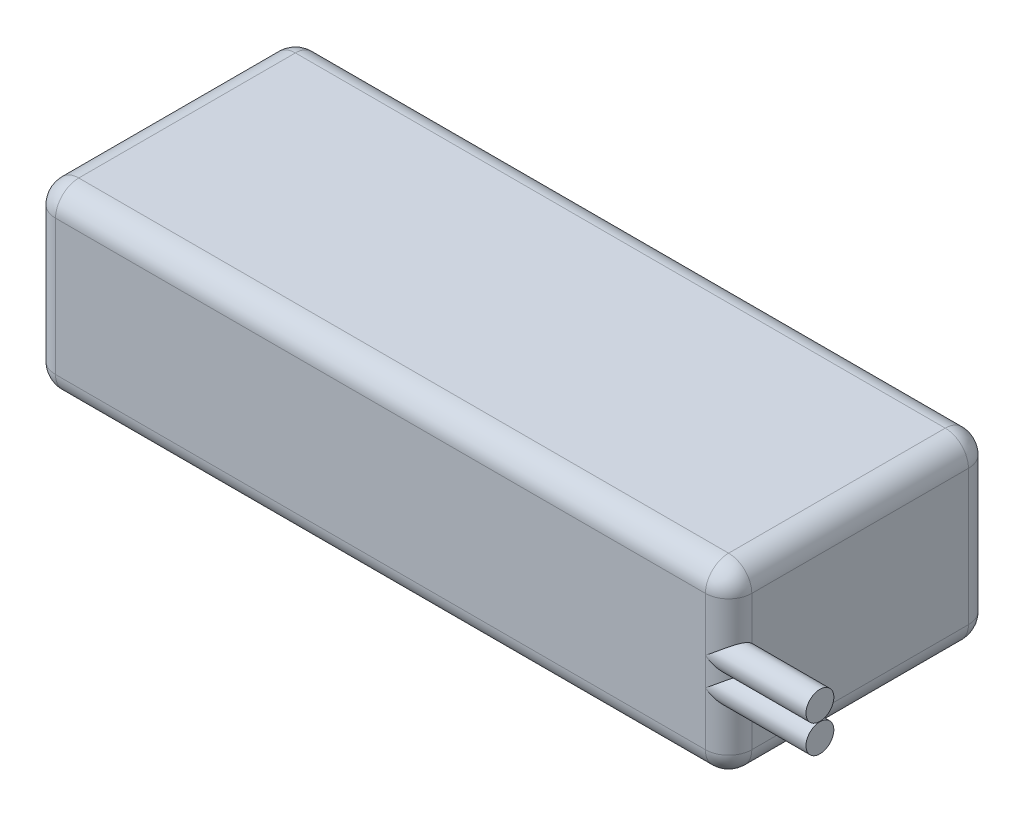
ISO-10303-21;
HEADER;
FILE_DESCRIPTION(('STEP AP214'),'2;1');
FILE_NAME('part.step','',(''),(''),'','','');
FILE_SCHEMA(('AUTOMOTIVE_DESIGN { 1 0 10303 214 1 1 1 1 }'));
ENDSEC;
DATA;
#1=APPLICATION_CONTEXT('core data for automotive mechanical design processes');
#2=APPLICATION_PROTOCOL_DEFINITION('international standard','automotive_design',2000,#1);
#3=PRODUCT_CONTEXT('',#1,'mechanical');
#4=PRODUCT('Part','Part','',(#3));
#5=PRODUCT_RELATED_PRODUCT_CATEGORY('part','',(#4));
#6=PRODUCT_DEFINITION_FORMATION('','',#4);
#7=PRODUCT_DEFINITION_CONTEXT('part definition',#1,'design');
#8=PRODUCT_DEFINITION('design','',#6,#7);
#9=PRODUCT_DEFINITION_SHAPE('','',#8);
#10=(LENGTH_UNIT() NAMED_UNIT(*) SI_UNIT(.MILLI.,.METRE.));
#11=(NAMED_UNIT(*) PLANE_ANGLE_UNIT() SI_UNIT($,.RADIAN.));
#12=(NAMED_UNIT(*) SI_UNIT($,.STERADIAN.) SOLID_ANGLE_UNIT());
#13=UNCERTAINTY_MEASURE_WITH_UNIT(LENGTH_MEASURE(1.E-05),#10,'distance_accuracy_value','');
#14=(GEOMETRIC_REPRESENTATION_CONTEXT(3) GLOBAL_UNCERTAINTY_ASSIGNED_CONTEXT((#13)) GLOBAL_UNIT_ASSIGNED_CONTEXT((#10,
#11,#12)) REPRESENTATION_CONTEXT('',''));
#15=CARTESIAN_POINT('',(0.,0.,0.));
#16=DIRECTION('',(0.,0.,1.));
#17=DIRECTION('',(1.,0.,0.));
#18=AXIS2_PLACEMENT_3D('',#15,#16,#17);
#19=CARTESIAN_POINT('',(-42.6513569937369,23.5,-15.3131524008351));
#20=DIRECTION('',(1.,0.,0.));
#21=DIRECTION('',(0.,0.,-1.));
#22=AXIS2_PLACEMENT_3D('',#19,#20,#21);
#23=PLANE('',#22);
#24=DIRECTION('',(0.,-1.,0.));
#25=VECTOR('',#24,1.);
#26=CARTESIAN_POINT('',(-42.6513569937369,23.5,15.6868475991649));
#27=LINE('',#26,#25);
#28=CARTESIAN_POINT('',(-42.6513569937369,3.,15.6868475991649));
#29=VERTEX_POINT('',#28);
#30=CARTESIAN_POINT('',(-42.6513569937369,20.5,15.6868475991649));
#31=VERTEX_POINT('',#30);
#32=EDGE_CURVE('E158',#29,#31,#27,.F.);
#33=ORIENTED_EDGE('',*,*,#32,.T.);
#34=DIRECTION('',(0.,0.,1.));
#35=VECTOR('',#34,1.);
#36=CARTESIAN_POINT('',(-42.6513569937369,20.5,-15.3131524008351));
#37=LINE('',#36,#35);
#38=CARTESIAN_POINT('',(-42.6513569937369,20.5,-12.3131524008351));
#39=VERTEX_POINT('',#38);
#40=EDGE_CURVE('E204',#31,#39,#37,.F.);
#41=ORIENTED_EDGE('',*,*,#40,.T.);
#42=DIRECTION('',(0.,-1.,0.));
#43=VECTOR('',#42,1.);
#44=CARTESIAN_POINT('',(-42.6513569937369,23.5,-12.3131524008351));
#45=LINE('',#44,#43);
#46=CARTESIAN_POINT('',(-42.6513569937369,3.,-12.3131524008351));
#47=VERTEX_POINT('',#46);
#48=EDGE_CURVE('E200',#39,#47,#45,.T.);
#49=ORIENTED_EDGE('',*,*,#48,.T.);
#50=DIRECTION('',(0.,0.,1.));
#51=VECTOR('',#50,1.);
#52=CARTESIAN_POINT('',(-42.6513569937369,3.,-15.3131524008351));
#53=LINE('',#52,#51);
#54=EDGE_CURVE('E193',#47,#29,#53,.T.);
#55=ORIENTED_EDGE('',*,*,#54,.T.);
#56=EDGE_LOOP('',(#33,#41,#49,#55));
#57=FACE_BOUND('',#56,.T.);
#58=ADVANCED_FACE('F40',(#57),#23,.F.);
#59=CARTESIAN_POINT('',(-42.6513569937369,23.5,18.6868475991649));
#60=DIRECTION('',(0.,0.,-1.));
#61=DIRECTION('',(-1.,0.,0.));
#62=AXIS2_PLACEMENT_3D('',#59,#60,#61);
#63=PLANE('',#62);
#64=DIRECTION('',(0.,-1.,0.));
#65=VECTOR('',#64,1.);
#66=CARTESIAN_POINT('',(44.3486430062631,23.5,18.6868475991649));
#67=LINE('',#66,#65);
#68=CARTESIAN_POINT('',(44.3486430062631,13.57,18.6868475991649));
#69=VERTEX_POINT('',#68);
#70=CARTESIAN_POINT('',(44.3486430062631,20.5,18.6868475991649));
#71=VERTEX_POINT('',#70);
#72=EDGE_CURVE('E189',#69,#71,#67,.F.);
#73=ORIENTED_EDGE('',*,*,#72,.T.);
#74=DIRECTION('',(1.,0.,0.));
#75=VECTOR('',#74,1.);
#76=CARTESIAN_POINT('',(-42.6513569937369,20.5,18.6868475991649));
#77=LINE('',#76,#75);
#78=CARTESIAN_POINT('',(-39.6513569937369,20.5,18.6868475991649));
#79=VERTEX_POINT('',#78);
#80=EDGE_CURVE('E186',#71,#79,#77,.F.);
#81=ORIENTED_EDGE('',*,*,#80,.T.);
#82=DIRECTION('',(0.,-1.,0.));
#83=VECTOR('',#82,1.);
#84=CARTESIAN_POINT('',(-39.6513569937369,23.5,18.6868475991649));
#85=LINE('',#84,#83);
#86=CARTESIAN_POINT('',(-39.6513569937369,3.,18.6868475991649));
#87=VERTEX_POINT('',#86);
#88=EDGE_CURVE('E156',#79,#87,#85,.T.);
#89=ORIENTED_EDGE('',*,*,#88,.T.);
#90=DIRECTION('',(1.,0.,0.));
#91=VECTOR('',#90,1.);
#92=CARTESIAN_POINT('',(-42.6513569937369,3.,18.6868475991649));
#93=LINE('',#92,#91);
#94=CARTESIAN_POINT('',(44.3486430062631,3.,18.6868475991649));
#95=VERTEX_POINT('',#94);
#96=EDGE_CURVE('E174',#87,#95,#93,.T.);
#97=ORIENTED_EDGE('',*,*,#96,.T.);
#98=DIRECTION('',(0.,-1.,0.));
#99=VECTOR('',#98,1.);
#100=CARTESIAN_POINT('',(44.3486430062631,23.5,18.6868475991649));
#101=LINE('',#100,#99);
#102=CARTESIAN_POINT('',(44.3486430062631,9.93,18.6868475991649));
#103=VERTEX_POINT('',#102);
#104=EDGE_CURVE('E181',#95,#103,#101,.F.);
#105=ORIENTED_EDGE('',*,*,#104,.T.);
#106=DIRECTION('',(0.,-1.,0.));
#107=VECTOR('',#106,1.);
#108=CARTESIAN_POINT('',(44.3486430062631,23.5,18.6868475991649));
#109=LINE('',#108,#107);
#110=EDGE_CURVE('E195',#103,#69,#109,.F.);
#111=ORIENTED_EDGE('',*,*,#110,.T.);
#112=EDGE_LOOP('',(#73,#81,#89,#97,#105,#111));
#113=FACE_BOUND('',#112,.T.);
#114=ADVANCED_FACE('F184',(#113),#63,.F.);
#115=CARTESIAN_POINT('',(47.3486430062631,23.5,-15.3131524008351));
#116=DIRECTION('',(-1.,0.,0.));
#117=DIRECTION('',(0.,0.,1.));
#118=AXIS2_PLACEMENT_3D('',#115,#116,#117);
#119=PLANE('',#118);
#120=CARTESIAN_POINT('',(47.3486430062631,13.57,16.8868475991649));
#121=DIRECTION('',(1.,0.,0.));
#122=DIRECTION('',(0.,0.,-1.));
#123=AXIS2_PLACEMENT_3D('',#120,#121,#122);
#124=CIRCLE('',#123,1.8);
#125=CARTESIAN_POINT('',(47.3486430062631,12.2283592135001,15.6868475991649));
#126=VERTEX_POINT('',#125);
#127=CARTESIAN_POINT('',(47.3486430062631,14.9116407864999,15.6868475991649));
#128=VERTEX_POINT('',#127);
#129=EDGE_CURVE('E411',#126,#128,#124,.T.);
#130=ORIENTED_EDGE('',*,*,#129,.F.);
#131=DIRECTION('',(0.,-1.,0.));
#132=VECTOR('',#131,1.);
#133=CARTESIAN_POINT('',(47.3486430062631,23.5,15.6868475991649));
#134=LINE('',#133,#132);
#135=CARTESIAN_POINT('',(47.3486430062631,11.2716407864999,15.6868475991649));
#136=VERTEX_POINT('',#135);
#137=EDGE_CURVE('E218',#126,#136,#134,.T.);
#138=ORIENTED_EDGE('',*,*,#137,.T.);
#139=CARTESIAN_POINT('',(47.3486430062631,9.93,16.8868475991649));
#140=DIRECTION('',(1.,0.,0.));
#141=DIRECTION('',(0.,0.,-1.));
#142=AXIS2_PLACEMENT_3D('',#139,#140,#141);
#143=CIRCLE('',#142,1.8);
#144=CARTESIAN_POINT('',(47.3486430062631,8.58835921350013,15.6868475991649));
#145=VERTEX_POINT('',#144);
#146=EDGE_CURVE('E401',#145,#136,#143,.T.);
#147=ORIENTED_EDGE('',*,*,#146,.F.);
#148=DIRECTION('',(0.,-1.,0.));
#149=VECTOR('',#148,1.);
#150=CARTESIAN_POINT('',(47.3486430062631,23.5,15.6868475991649));
#151=LINE('',#150,#149);
#152=CARTESIAN_POINT('',(47.3486430062631,3.,15.6868475991649));
#153=VERTEX_POINT('',#152);
#154=EDGE_CURVE('E211',#145,#153,#151,.T.);
#155=ORIENTED_EDGE('',*,*,#154,.T.);
#156=DIRECTION('',(0.,0.,-1.));
#157=VECTOR('',#156,1.);
#158=CARTESIAN_POINT('',(47.3486430062631,3.,-15.3131524008351));
#159=LINE('',#158,#157);
#160=CARTESIAN_POINT('',(47.3486430062631,3.,-12.3131524008351));
#161=VERTEX_POINT('',#160);
#162=EDGE_CURVE('E207',#153,#161,#159,.T.);
#163=ORIENTED_EDGE('',*,*,#162,.T.);
#164=DIRECTION('',(0.,-1.,0.));
#165=VECTOR('',#164,1.);
#166=CARTESIAN_POINT('',(47.3486430062631,23.5,-12.3131524008351));
#167=LINE('',#166,#165);
#168=CARTESIAN_POINT('',(47.3486430062631,20.5,-12.3131524008351));
#169=VERTEX_POINT('',#168);
#170=EDGE_CURVE('E209',#161,#169,#167,.F.);
#171=ORIENTED_EDGE('',*,*,#170,.T.);
#172=DIRECTION('',(0.,0.,-1.));
#173=VECTOR('',#172,1.);
#174=CARTESIAN_POINT('',(47.3486430062631,20.5,18.6868475991649));
#175=LINE('',#174,#173);
#176=CARTESIAN_POINT('',(47.3486430062631,20.5,15.6868475991649));
#177=VERTEX_POINT('',#176);
#178=EDGE_CURVE('E213',#169,#177,#175,.F.);
#179=ORIENTED_EDGE('',*,*,#178,.T.);
#180=DIRECTION('',(0.,-1.,0.));
#181=VECTOR('',#180,1.);
#182=CARTESIAN_POINT('',(47.3486430062631,23.5,15.6868475991649));
#183=LINE('',#182,#181);
#184=EDGE_CURVE('E215',#177,#128,#183,.T.);
#185=ORIENTED_EDGE('',*,*,#184,.T.);
#186=EDGE_LOOP('',(#130,#138,#147,#155,#163,#171,#179,#185));
#187=FACE_BOUND('',#186,.T.);
#188=ADVANCED_FACE('F321',(#187),#119,.F.);
#189=CARTESIAN_POINT('',(-42.6513569937369,23.5,-15.3131524008351));
#190=DIRECTION('',(0.,0.,1.));
#191=DIRECTION('',(1.,0.,0.));
#192=AXIS2_PLACEMENT_3D('',#189,#190,#191);
#193=PLANE('',#192);
#194=DIRECTION('',(0.,-1.,0.));
#195=VECTOR('',#194,1.);
#196=CARTESIAN_POINT('',(-39.6513569937369,23.5,-15.3131524008351));
#197=LINE('',#196,#195);
#198=CARTESIAN_POINT('',(-39.6513569937369,3.,-15.3131524008351));
#199=VERTEX_POINT('',#198);
#200=CARTESIAN_POINT('',(-39.6513569937369,20.5,-15.3131524008351));
#201=VERTEX_POINT('',#200);
#202=EDGE_CURVE('E223',#199,#201,#197,.F.);
#203=ORIENTED_EDGE('',*,*,#202,.T.);
#204=DIRECTION('',(-1.,0.,0.));
#205=VECTOR('',#204,1.);
#206=CARTESIAN_POINT('',(47.3486430062631,20.5,-15.3131524008351));
#207=LINE('',#206,#205);
#208=CARTESIAN_POINT('',(44.3486430062631,20.5,-15.3131524008351));
#209=VERTEX_POINT('',#208);
#210=EDGE_CURVE('E228',#201,#209,#207,.F.);
#211=ORIENTED_EDGE('',*,*,#210,.T.);
#212=DIRECTION('',(0.,-1.,0.));
#213=VECTOR('',#212,1.);
#214=CARTESIAN_POINT('',(44.3486430062631,23.5,-15.3131524008351));
#215=LINE('',#214,#213);
#216=CARTESIAN_POINT('',(44.3486430062631,3.,-15.3131524008351));
#217=VERTEX_POINT('',#216);
#218=EDGE_CURVE('E225',#209,#217,#215,.T.);
#219=ORIENTED_EDGE('',*,*,#218,.T.);
#220=DIRECTION('',(-1.,0.,0.));
#221=VECTOR('',#220,1.);
#222=CARTESIAN_POINT('',(-42.6513569937369,3.,-15.3131524008351));
#223=LINE('',#222,#221);
#224=EDGE_CURVE('E220',#217,#199,#223,.T.);
#225=ORIENTED_EDGE('',*,*,#224,.T.);
#226=EDGE_LOOP('',(#203,#211,#219,#225));
#227=FACE_BOUND('',#226,.T.);
#228=ADVANCED_FACE('F483',(#227),#193,.F.);
#229=CARTESIAN_POINT('',(0.,23.5,0.));
#230=DIRECTION('',(0.,1.,0.));
#231=DIRECTION('',(0.,0.,1.));
#232=AXIS2_PLACEMENT_3D('',#229,#230,#231);
#233=PLANE('',#232);
#234=DIRECTION('',(0.,0.,-1.));
#235=VECTOR('',#234,1.);
#236=CARTESIAN_POINT('',(44.3486430062631,23.5,-15.3131524008351));
#237=LINE('',#236,#235);
#238=CARTESIAN_POINT('',(44.3486430062631,23.5,15.6868475991649));
#239=VERTEX_POINT('',#238);
#240=CARTESIAN_POINT('',(44.3486430062631,23.5,-12.3131524008351));
#241=VERTEX_POINT('',#240);
#242=EDGE_CURVE('E235',#239,#241,#237,.T.);
#243=ORIENTED_EDGE('',*,*,#242,.T.);
#244=DIRECTION('',(-1.,0.,0.));
#245=VECTOR('',#244,1.);
#246=CARTESIAN_POINT('',(-42.6513569937369,23.5,-12.3131524008351));
#247=LINE('',#246,#245);
#248=CARTESIAN_POINT('',(-39.6513569937369,23.5,-12.3131524008351));
#249=VERTEX_POINT('',#248);
#250=EDGE_CURVE('E237',#241,#249,#247,.T.);
#251=ORIENTED_EDGE('',*,*,#250,.T.);
#252=DIRECTION('',(0.,0.,1.));
#253=VECTOR('',#252,1.);
#254=CARTESIAN_POINT('',(-39.6513569937369,23.5,18.6868475991649));
#255=LINE('',#254,#253);
#256=CARTESIAN_POINT('',(-39.6513569937369,23.5,15.6868475991649));
#257=VERTEX_POINT('',#256);
#258=EDGE_CURVE('E230',#249,#257,#255,.T.);
#259=ORIENTED_EDGE('',*,*,#258,.T.);
#260=DIRECTION('',(1.,0.,0.));
#261=VECTOR('',#260,1.);
#262=CARTESIAN_POINT('',(47.3486430062631,23.5,15.6868475991649));
#263=LINE('',#262,#261);
#264=EDGE_CURVE('E232',#257,#239,#263,.T.);
#265=ORIENTED_EDGE('',*,*,#264,.T.);
#266=EDGE_LOOP('',(#243,#251,#259,#265));
#267=FACE_BOUND('',#266,.T.);
#268=ADVANCED_FACE('F477',(#267),#233,.T.);
#269=CARTESIAN_POINT('',(0.,0.,0.));
#270=DIRECTION('',(0.,1.,0.));
#271=DIRECTION('',(0.,0.,1.));
#272=AXIS2_PLACEMENT_3D('',#269,#270,#271);
#273=PLANE('',#272);
#274=DIRECTION('',(0.,0.,-1.));
#275=VECTOR('',#274,1.);
#276=CARTESIAN_POINT('',(44.3486430062631,0.,0.));
#277=LINE('',#276,#275);
#278=CARTESIAN_POINT('',(44.3486430062631,0.,-12.3131524008351));
#279=VERTEX_POINT('',#278);
#280=CARTESIAN_POINT('',(44.3486430062631,0.,15.6868475991649));
#281=VERTEX_POINT('',#280);
#282=EDGE_CURVE('E244',#279,#281,#277,.F.);
#283=ORIENTED_EDGE('',*,*,#282,.T.);
#284=DIRECTION('',(1.,0.,0.));
#285=VECTOR('',#284,1.);
#286=CARTESIAN_POINT('',(0.,0.,15.6868475991649));
#287=LINE('',#286,#285);
#288=CARTESIAN_POINT('',(-39.6513569937369,0.,15.6868475991649));
#289=VERTEX_POINT('',#288);
#290=EDGE_CURVE('E246',#281,#289,#287,.F.);
#291=ORIENTED_EDGE('',*,*,#290,.T.);
#292=DIRECTION('',(0.,0.,1.));
#293=VECTOR('',#292,1.);
#294=CARTESIAN_POINT('',(-39.6513569937369,0.,0.));
#295=LINE('',#294,#293);
#296=CARTESIAN_POINT('',(-39.6513569937369,0.,-12.3131524008351));
#297=VERTEX_POINT('',#296);
#298=EDGE_CURVE('E240',#289,#297,#295,.F.);
#299=ORIENTED_EDGE('',*,*,#298,.T.);
#300=DIRECTION('',(-1.,0.,0.));
#301=VECTOR('',#300,1.);
#302=CARTESIAN_POINT('',(0.,0.,-12.3131524008351));
#303=LINE('',#302,#301);
#304=EDGE_CURVE('E242',#297,#279,#303,.F.);
#305=ORIENTED_EDGE('',*,*,#304,.T.);
#306=EDGE_LOOP('',(#283,#291,#299,#305));
#307=FACE_BOUND('',#306,.T.);
#308=ADVANCED_FACE('F312',(#307),#273,.F.);
#309=CARTESIAN_POINT('',(57.3486430062631,13.57,16.8868475991649));
#310=DIRECTION('',(-1.,0.,0.));
#311=DIRECTION('',(0.,0.,1.));
#312=AXIS2_PLACEMENT_3D('',#309,#310,#311);
#313=CYLINDRICAL_SURFACE('',#312,1.8);
#314=CARTESIAN_POINT('',(57.3486430062631,13.57,16.8868475991649));
#315=DIRECTION('',(1.,0.,0.));
#316=DIRECTION('',(0.,0.,-1.));
#317=AXIS2_PLACEMENT_3D('',#314,#315,#316);
#318=CIRCLE('',#317,1.8);
#319=CARTESIAN_POINT('',(57.3486430062631,13.57,15.0868475991649));
#320=VERTEX_POINT('',#319);
#321=EDGE_CURVE('E182',#320,#320,#318,.T.);
#322=ORIENTED_EDGE('',*,*,#321,.F.);
#323=EDGE_LOOP('',(#322));
#324=FACE_BOUND('',#323,.T.);
#325=CARTESIAN_POINT('',(47.3486430062631,14.9116407864998,15.6868475991649));
#326=CARTESIAN_POINT('',(47.3486458378384,14.9421026291827,15.720896157732));
#327=CARTESIAN_POINT('',(47.3480633616879,14.9712623522462,15.7561155584714));
#328=CARTESIAN_POINT('',(47.3455091274964,15.0268076541683,15.8286447765796));
#329=CARTESIAN_POINT('',(47.3435369841892,15.0531924613879,15.8659551710065));
#330=CARTESIAN_POINT('',(47.3379862603682,15.1029851888726,15.9423717709487));
#331=CARTESIAN_POINT('',(47.3344086961762,15.1263949804781,15.981476826304));
#332=CARTESIAN_POINT('',(47.3254690058548,15.1701034031996,16.0611730367378));
#333=CARTESIAN_POINT('',(47.320107106135,15.1904024285556,16.1017640026918));
#334=CARTESIAN_POINT('',(47.3010677119526,15.2465370665387,16.225479826577));
#335=CARTESIAN_POINT('',(47.2844437488557,15.2775353536821,16.3104320418846));
#336=CARTESIAN_POINT('',(47.242715875428,15.326126897379,16.4819152132492));
#337=CARTESIAN_POINT('',(47.2176197285315,15.3437323784698,16.5684446555977));
#338=CARTESIAN_POINT('',(47.1596543365652,15.3658916677007,16.7385738608466));
#339=CARTESIAN_POINT('',(47.1269503716062,15.3706991571385,16.8221976188468));
#340=CARTESIAN_POINT('',(47.0541992449735,15.3691346441954,16.986089951071));
#341=CARTESIAN_POINT('',(47.0141451649545,15.3627520602552,17.0663552759972));
#342=CARTESIAN_POINT('',(46.9126375023519,15.3363711917413,17.248990327455));
#343=CARTESIAN_POINT('',(46.848584989657,15.3124113095963,17.3493455697909));
#344=CARTESIAN_POINT('',(46.711521588595,15.2506703933249,17.5390297527127));
#345=CARTESIAN_POINT('',(46.6384964064077,15.212867111356,17.6283406330123));
#346=CARTESIAN_POINT('',(46.4573933776811,15.1107896834007,17.8262898706756));
#347=CARTESIAN_POINT('',(46.3463551038881,15.0418975428539,17.9298234333511));
#348=CARTESIAN_POINT('',(46.1158914371437,14.8908139399465,18.1156029855923));
#349=CARTESIAN_POINT('',(45.996448792202,14.8085946413717,18.1978034615564));
#350=CARTESIAN_POINT('',(45.7045434841727,14.6016020938475,18.3701939282813));
#351=CARTESIAN_POINT('',(45.529493716921,14.4726972963242,18.451104435991));
#352=CARTESIAN_POINT('',(45.263081813341,14.2727398455316,18.5456369881858));
#353=CARTESIAN_POINT('',(45.1736218749728,14.2049745428649,18.5726780850464));
#354=CARTESIAN_POINT('',(44.9937375900738,14.0678500341268,18.6181370230395));
#355=CARTESIAN_POINT('',(44.9033133425686,13.9984909908892,18.6365557410533));
#356=CARTESIAN_POINT('',(44.6613555478066,13.8122157966257,18.6744276994282));
#357=CARTESIAN_POINT('',(44.5092401648721,13.6943978351517,18.686396737623));
#358=CARTESIAN_POINT('',(44.3544164434995,13.5744720842221,18.686843428053));
#359=CARTESIAN_POINT('',(44.351529688934,13.5722360136734,18.6868475943474));
#360=CARTESIAN_POINT('',(44.3486430062631,13.57,18.6868475991649));
#361=B_SPLINE_CURVE_WITH_KNOTS('',3,(#325,#326,#327,#328,#329,#330,#331,#332,#333,#334,#335,
#336,#337,#338,#339,#340,#341,#342,#343,#344,#345,#346,#347,#348,#349,#350,#351,#352,#353,#354,
#355,#356,#357,#358,#359,#360),.UNSPECIFIED.,.F.,.F.,(4,2,2,2,2,2,2,2,2,2,2,2,2,2,2,2,2,4),(0.,
0.137027678568575,0.274093361127961,0.411072395521077,0.548034055622927,0.822365651963787,
1.09644654549511,1.3650527013983,1.63391299372154,1.99622796914781,2.35912779788252,
2.85652768681326,3.35498020051371,4.04687361227118,4.39294477467943,4.7389807345861,
5.31552760500975,5.32648206329203),.UNSPECIFIED.);
#362=EDGE_CURVE('E64',#128,#69,#361,.T.);
#363=ORIENTED_EDGE('',*,*,#362,.T.);
#364=CARTESIAN_POINT('',(47.3486430062631,12.2283592135001,15.6868475991649));
#365=CARTESIAN_POINT('',(47.3486458378384,12.1978973708173,15.7208961577321));
#366=CARTESIAN_POINT('',(47.3480633616879,12.1687376477537,15.7561155584715));
#367=CARTESIAN_POINT('',(47.3455091274964,12.1131923458317,15.8286447765796));
#368=CARTESIAN_POINT('',(47.3435369841892,12.0868075386121,15.8659551710065));
#369=CARTESIAN_POINT('',(47.3379862603682,12.0370148111274,15.9423717709487));
#370=CARTESIAN_POINT('',(47.3344086961762,12.0136050195219,15.981476826304));
#371=CARTESIAN_POINT('',(47.3254690058548,11.9698965968003,16.0611730367379));
#372=CARTESIAN_POINT('',(47.320107106135,11.9495975714443,16.1017640026918));
#373=CARTESIAN_POINT('',(47.3010677119526,11.8934629334613,16.225479826577));
#374=CARTESIAN_POINT('',(47.2844437488557,11.8624646463179,16.3104320418846));
#375=CARTESIAN_POINT('',(47.242715875428,11.813873102621,16.4819152132492));
#376=CARTESIAN_POINT('',(47.2176197285315,11.7962676215302,16.5684446555977));
#377=CARTESIAN_POINT('',(47.1596543365652,11.7741083322993,16.7385738608466));
#378=CARTESIAN_POINT('',(47.1269503716062,11.7693008428615,16.8221976188468));
#379=CARTESIAN_POINT('',(47.0541992449735,11.7708653558046,16.986089951071));
#380=CARTESIAN_POINT('',(47.0141451649545,11.7772479397448,17.0663552759972));
#381=CARTESIAN_POINT('',(46.9126375023519,11.8036288082587,17.248990327455));
#382=CARTESIAN_POINT('',(46.848584989657,11.8275886904037,17.3493455697909));
#383=CARTESIAN_POINT('',(46.711521588595,11.8893296066751,17.5390297527127));
#384=CARTESIAN_POINT('',(46.6384964064076,11.927132888644,17.6283406330123));
#385=CARTESIAN_POINT('',(46.4573933776811,12.0292103165992,17.8262898706756));
#386=CARTESIAN_POINT('',(46.3463551038881,12.0981024571461,17.9298234333511));
#387=CARTESIAN_POINT('',(46.1158914371437,12.2491860600535,18.1156029855924));
#388=CARTESIAN_POINT('',(45.996448792202,12.3314053586283,18.1978034615564));
#389=CARTESIAN_POINT('',(45.7045434841727,12.5383979061525,18.3701939282813));
#390=CARTESIAN_POINT('',(45.529493716921,12.6673027036758,18.451104435991));
#391=CARTESIAN_POINT('',(45.263081813341,12.8672601544684,18.5456369881858));
#392=CARTESIAN_POINT('',(45.1736218749728,12.9350254571351,18.5726780850464));
#393=CARTESIAN_POINT('',(44.9937375900738,13.0721499658732,18.6181370230395));
#394=CARTESIAN_POINT('',(44.9033133425686,13.1415090091108,18.6365557410533));
#395=CARTESIAN_POINT('',(44.6613555478066,13.3277842033743,18.6744276994282));
#396=CARTESIAN_POINT('',(44.5092401648721,13.4456021648483,18.686396737623));
#397=CARTESIAN_POINT('',(44.3544164434995,13.5655279157779,18.686843428053));
#398=CARTESIAN_POINT('',(44.351529688934,13.5677639863266,18.6868475943474));
#399=CARTESIAN_POINT('',(44.3486430062631,13.57,18.6868475991649));
#400=B_SPLINE_CURVE_WITH_KNOTS('',3,(#364,#365,#366,#367,#368,#369,#370,#371,#372,#373,#374,
#375,#376,#377,#378,#379,#380,#381,#382,#383,#384,#385,#386,#387,#388,#389,#390,#391,#392,#393,
#394,#395,#396,#397,#398,#399),.UNSPECIFIED.,.F.,.F.,(4,2,2,2,2,2,2,2,2,2,2,2,2,2,2,2,2,4),(0.,
0.137027678568574,0.274093361127961,0.411072395521075,0.548034055622925,0.822365651963781,
1.0964465454951,1.36505270139829,1.63391299372153,1.9962279691478,2.35912779788251,
2.85652768681326,3.3549802005137,4.04687361227118,4.39294477467943,4.73898073458609,
5.31552760500973,5.32648206329201),.UNSPECIFIED.);
#401=EDGE_CURVE('E49',#69,#126,#400,.F.);
#402=ORIENTED_EDGE('',*,*,#401,.T.);
#403=ORIENTED_EDGE('',*,*,#129,.T.);
#404=EDGE_LOOP('',(#363,#402,#403));
#405=FACE_BOUND('',#404,.T.);
#406=ADVANCED_FACE('F262',(#324,#405),#313,.T.);
#407=CARTESIAN_POINT('',(57.3486430062631,13.57,16.8868475991649));
#408=DIRECTION('',(1.,0.,0.));
#409=DIRECTION('',(0.,0.,-1.));
#410=AXIS2_PLACEMENT_3D('',#407,#408,#409);
#411=PLANE('',#410);
#412=ORIENTED_EDGE('',*,*,#321,.T.);
#413=EDGE_LOOP('',(#412));
#414=FACE_BOUND('',#413,.T.);
#415=ADVANCED_FACE('F304',(#414),#411,.T.);
#416=CARTESIAN_POINT('',(57.3486430062631,9.93,16.8868475991649));
#417=DIRECTION('',(-1.,0.,0.));
#418=DIRECTION('',(0.,0.,1.));
#419=AXIS2_PLACEMENT_3D('',#416,#417,#418);
#420=CYLINDRICAL_SURFACE('',#419,1.8);
#421=CARTESIAN_POINT('',(57.3486430062631,9.93,16.8868475991649));
#422=DIRECTION('',(1.,0.,0.));
#423=DIRECTION('',(0.,0.,-1.));
#424=AXIS2_PLACEMENT_3D('',#421,#422,#423);
#425=CIRCLE('',#424,1.8);
#426=CARTESIAN_POINT('',(57.3486430062631,9.93,15.0868475991649));
#427=VERTEX_POINT('',#426);
#428=EDGE_CURVE('E406',#427,#427,#425,.T.);
#429=ORIENTED_EDGE('',*,*,#428,.F.);
#430=EDGE_LOOP('',(#429));
#431=FACE_BOUND('',#430,.T.);
#432=CARTESIAN_POINT('',(47.3486430062631,11.2716407864998,15.6868475991649));
#433=CARTESIAN_POINT('',(47.3486458378384,11.3021026291827,15.720896157732));
#434=CARTESIAN_POINT('',(47.3480633616879,11.3312623522462,15.7561155584714));
#435=CARTESIAN_POINT('',(47.3455091274964,11.3868076541683,15.8286447765796));
#436=CARTESIAN_POINT('',(47.3435369841892,11.4131924613879,15.8659551710065));
#437=CARTESIAN_POINT('',(47.3379862603682,11.4629851888726,15.9423717709487));
#438=CARTESIAN_POINT('',(47.3344086961762,11.4863949804781,15.981476826304));
#439=CARTESIAN_POINT('',(47.3254690058548,11.5301034031996,16.0611730367378));
#440=CARTESIAN_POINT('',(47.320107106135,11.5504024285556,16.1017640026918));
#441=CARTESIAN_POINT('',(47.3010677119526,11.6065370665387,16.225479826577));
#442=CARTESIAN_POINT('',(47.2844437488557,11.6375353536821,16.3104320418846));
#443=CARTESIAN_POINT('',(47.2427158754281,11.686126897379,16.4819152132492));
#444=CARTESIAN_POINT('',(47.2176197285315,11.7037323784698,16.5684446555977));
#445=CARTESIAN_POINT('',(47.1596543365652,11.7258916677007,16.7385738608466));
#446=CARTESIAN_POINT('',(47.1269503716062,11.7306991571385,16.8221976188468));
#447=CARTESIAN_POINT('',(47.0541992449735,11.7291346441954,16.986089951071));
#448=CARTESIAN_POINT('',(47.0141451649545,11.7227520602552,17.0663552759972));
#449=CARTESIAN_POINT('',(46.9126375023519,11.6963711917413,17.248990327455));
#450=CARTESIAN_POINT('',(46.848584989657,11.6724113095963,17.3493455697909));
#451=CARTESIAN_POINT('',(46.711521588595,11.6106703933249,17.5390297527127));
#452=CARTESIAN_POINT('',(46.6384964064077,11.5728671113561,17.6283406330123));
#453=CARTESIAN_POINT('',(46.4573933776811,11.4707896834007,17.8262898706756));
#454=CARTESIAN_POINT('',(46.3463551038881,11.4018975428538,17.9298234333512));
#455=CARTESIAN_POINT('',(46.1158914371437,11.2508139399465,18.1156029855924));
#456=CARTESIAN_POINT('',(45.9964487922019,11.1685946413718,18.1978034615564));
#457=CARTESIAN_POINT('',(45.7045434841728,10.9616020938474,18.3701939282813));
#458=CARTESIAN_POINT('',(45.5294937169215,10.8326972963238,18.451104435991));
#459=CARTESIAN_POINT('',(45.2630818133409,10.632739845532,18.5456369881858));
#460=CARTESIAN_POINT('',(45.1736218749724,10.5649745428657,18.5726780850464));
#461=CARTESIAN_POINT('',(44.9937375900744,10.4278500341262,18.6181370230395));
#462=CARTESIAN_POINT('',(44.9033133425706,10.3584909908866,18.6365557410533));
#463=CARTESIAN_POINT('',(44.6613555478032,10.17221579663,18.6744276994282));
#464=CARTESIAN_POINT('',(44.5092401648557,10.0543978351729,18.686396737623));
#465=CARTESIAN_POINT('',(44.3544164434988,9.93447208422293,18.686843428053));
#466=CARTESIAN_POINT('',(44.3515296889337,9.93223601367376,18.6868475943474));
#467=CARTESIAN_POINT('',(44.3486430062631,9.93,18.6868475991649));
#468=B_SPLINE_CURVE_WITH_KNOTS('',3,(#432,#433,#434,#435,#436,#437,#438,#439,#440,#441,#442,
#443,#444,#445,#446,#447,#448,#449,#450,#451,#452,#453,#454,#455,#456,#457,#458,#459,#460,#461,
#462,#463,#464,#465,#466,#467),.UNSPECIFIED.,.F.,.F.,(4,2,2,2,2,2,2,2,2,2,2,2,2,2,2,2,2,4),(0.,
0.137027678568579,0.274093361127971,0.41107239552108,0.548034055622925,0.822365651963775,
1.0964465454951,1.36505270139831,1.63391299372154,1.99622796914776,2.35912779788251,
2.85652768681337,3.3549802005137,4.04687361227102,4.39294477467933,4.73898073458609,
5.31552760500976,5.32648206329204),.UNSPECIFIED.);
#469=EDGE_CURVE('E56',#136,#103,#468,.T.);
#470=ORIENTED_EDGE('',*,*,#469,.T.);
#471=CARTESIAN_POINT('',(47.3486430062631,8.58835921350013,15.6868475991649));
#472=CARTESIAN_POINT('',(47.3486458378384,8.55789737081728,15.7208961577321));
#473=CARTESIAN_POINT('',(47.3480633616879,8.52873764775374,15.7561155584715));
#474=CARTESIAN_POINT('',(47.3455091274964,8.47319234583166,15.8286447765796));
#475=CARTESIAN_POINT('',(47.3435369841892,8.44680753861213,15.8659551710065));
#476=CARTESIAN_POINT('',(47.3379862603682,8.3970148111274,15.9423717709487));
#477=CARTESIAN_POINT('',(47.3344086961762,8.37360501952186,15.981476826304));
#478=CARTESIAN_POINT('',(47.3254690058548,8.32989659680035,16.0611730367379));
#479=CARTESIAN_POINT('',(47.320107106135,8.30959757144434,16.1017640026918));
#480=CARTESIAN_POINT('',(47.3010677119526,8.25346293346129,16.225479826577));
#481=CARTESIAN_POINT('',(47.2844437488557,8.2224646463179,16.3104320418846));
#482=CARTESIAN_POINT('',(47.242715875428,8.17387310262101,16.4819152132492));
#483=CARTESIAN_POINT('',(47.2176197285315,8.15626762153019,16.5684446555977));
#484=CARTESIAN_POINT('',(47.1596543365652,8.13410833229933,16.7385738608466));
#485=CARTESIAN_POINT('',(47.1269503716062,8.12930084286147,16.8221976188468));
#486=CARTESIAN_POINT('',(47.0541992449735,8.13086535580456,16.986089951071));
#487=CARTESIAN_POINT('',(47.0141451649545,8.13724793974483,17.0663552759972));
#488=CARTESIAN_POINT('',(46.9126375023519,8.16362880825874,17.248990327455));
#489=CARTESIAN_POINT('',(46.848584989657,8.18758869040373,17.3493455697909));
#490=CARTESIAN_POINT('',(46.711521588595,8.24932960667512,17.5390297527127));
#491=CARTESIAN_POINT('',(46.6384964064077,8.28713288864394,17.6283406330123));
#492=CARTESIAN_POINT('',(46.4573933776811,8.38921031659926,17.8262898706756));
#493=CARTESIAN_POINT('',(46.3463551038881,8.45810245714617,17.9298234333512));
#494=CARTESIAN_POINT('',(46.1158914371437,8.6091860600535,18.1156029855924));
#495=CARTESIAN_POINT('',(45.9964487922019,8.69140535862824,18.1978034615564));
#496=CARTESIAN_POINT('',(45.7045434841728,8.89839790615258,18.3701939282813));
#497=CARTESIAN_POINT('',(45.5294937169215,9.02730270367622,18.451104435991));
#498=CARTESIAN_POINT('',(45.2630818133409,9.22726015446802,18.5456369881858));
#499=CARTESIAN_POINT('',(45.1736218749724,9.2950254571343,18.5726780850464));
#500=CARTESIAN_POINT('',(44.9937375900744,9.43214996587381,18.6181370230395));
#501=CARTESIAN_POINT('',(44.9033133425706,9.50150900911336,18.6365557410533));
#502=CARTESIAN_POINT('',(44.6613555478032,9.68778420336997,18.6744276994282));
#503=CARTESIAN_POINT('',(44.5092401648557,9.80560216482706,18.686396737623));
#504=CARTESIAN_POINT('',(44.3544164434988,9.92552791577706,18.686843428053));
#505=CARTESIAN_POINT('',(44.3515296889337,9.92776398632623,18.6868475943474));
#506=CARTESIAN_POINT('',(44.3486430062631,9.93,18.6868475991649));
#507=B_SPLINE_CURVE_WITH_KNOTS('',3,(#471,#472,#473,#474,#475,#476,#477,#478,#479,#480,#481,
#482,#483,#484,#485,#486,#487,#488,#489,#490,#491,#492,#493,#494,#495,#496,#497,#498,#499,#500,
#501,#502,#503,#504,#505,#506),.UNSPECIFIED.,.F.,.F.,(4,2,2,2,2,2,2,2,2,2,2,2,2,2,2,2,2,4),(0.,
0.13702767856858,0.27409336112797,0.411072395521078,0.548034055622923,0.822365651963776,
1.0964465454951,1.36505270139831,1.63391299372153,1.99622796914775,2.3591277978825,
2.85652768681336,3.35498020051369,4.046873612271,4.3929447746793,4.73898073458608,
5.31552760500974,5.32648206329202),.UNSPECIFIED.);
#508=EDGE_CURVE('E11',#103,#145,#507,.F.);
#509=ORIENTED_EDGE('',*,*,#508,.T.);
#510=ORIENTED_EDGE('',*,*,#146,.T.);
#511=EDGE_LOOP('',(#470,#509,#510));
#512=FACE_BOUND('',#511,.T.);
#513=ADVANCED_FACE('F299',(#431,#512),#420,.T.);
#514=CARTESIAN_POINT('',(57.3486430062631,9.93,16.8868475991649));
#515=DIRECTION('',(1.,0.,0.));
#516=DIRECTION('',(0.,0.,-1.));
#517=AXIS2_PLACEMENT_3D('',#514,#515,#516);
#518=PLANE('',#517);
#519=ORIENTED_EDGE('',*,*,#428,.T.);
#520=EDGE_LOOP('',(#519));
#521=FACE_BOUND('',#520,.T.);
#522=ADVANCED_FACE('F303',(#521),#518,.T.);
#523=CARTESIAN_POINT('',(44.3486430062631,23.5,-12.3131524008351));
#524=DIRECTION('',(0.,-1.,0.));
#525=DIRECTION('',(0.,0.,-1.));
#526=AXIS2_PLACEMENT_3D('',#523,#524,#525);
#527=CYLINDRICAL_SURFACE('',#526,3.);
#528=CARTESIAN_POINT('',(44.3486430062631,20.5,-12.3131524008351));
#529=DIRECTION('',(0.,1.,0.));
#530=DIRECTION('',(0.,0.,1.));
#531=AXIS2_PLACEMENT_3D('',#528,#529,#530);
#532=CIRCLE('',#531,3.);
#533=EDGE_CURVE('E44',#169,#209,#532,.T.);
#534=ORIENTED_EDGE('',*,*,#533,.F.);
#535=ORIENTED_EDGE('',*,*,#170,.F.);
#536=CARTESIAN_POINT('',(44.3486430062631,3.,-12.3131524008351));
#537=DIRECTION('',(0.,-1.,0.));
#538=DIRECTION('',(0.,0.,-1.));
#539=AXIS2_PLACEMENT_3D('',#536,#537,#538);
#540=CIRCLE('',#539,3.);
#541=EDGE_CURVE('E398',#217,#161,#540,.T.);
#542=ORIENTED_EDGE('',*,*,#541,.F.);
#543=ORIENTED_EDGE('',*,*,#218,.F.);
#544=EDGE_LOOP('',(#534,#535,#542,#543));
#545=FACE_BOUND('',#544,.T.);
#546=ADVANCED_FACE('F42',(#545),#527,.T.);
#547=CARTESIAN_POINT('',(44.3486430062631,20.5,-12.3131524008351));
#548=DIRECTION('',(0.,0.,1.));
#549=DIRECTION('',(1.,0.,0.));
#550=AXIS2_PLACEMENT_3D('',#547,#548,#549);
#551=SPHERICAL_SURFACE('',#550,3.);
#552=CARTESIAN_POINT('',(44.3486430062631,20.5,-12.3131524008351));
#553=DIRECTION('',(0.,0.,-1.));
#554=DIRECTION('',(-1.,0.,0.));
#555=AXIS2_PLACEMENT_3D('',#552,#553,#554);
#556=CIRCLE('',#555,3.);
#557=EDGE_CURVE('E386',#169,#241,#556,.F.);
#558=ORIENTED_EDGE('',*,*,#557,.F.);
#559=ORIENTED_EDGE('',*,*,#533,.T.);
#560=CARTESIAN_POINT('',(44.3486430062631,20.5,-12.3131524008351));
#561=DIRECTION('',(1.,0.,0.));
#562=DIRECTION('',(0.,1.,0.));
#563=AXIS2_PLACEMENT_3D('',#560,#561,#562);
#564=CIRCLE('',#563,3.);
#565=EDGE_CURVE('E390',#241,#209,#564,.F.);
#566=ORIENTED_EDGE('',*,*,#565,.F.);
#567=EDGE_LOOP('',(#558,#559,#566));
#568=FACE_BOUND('',#567,.T.);
#569=ADVANCED_FACE('F289',(#568),#551,.T.);
#570=CARTESIAN_POINT('',(44.3486430062631,23.5,15.6868475991649));
#571=DIRECTION('',(0.,-1.,0.));
#572=DIRECTION('',(0.,0.,-1.));
#573=AXIS2_PLACEMENT_3D('',#570,#571,#572);
#574=CYLINDRICAL_SURFACE('',#573,3.);
#575=ORIENTED_EDGE('',*,*,#137,.F.);
#576=ORIENTED_EDGE('',*,*,#401,.F.);
#577=ORIENTED_EDGE('',*,*,#110,.F.);
#578=ORIENTED_EDGE('',*,*,#469,.F.);
#579=EDGE_LOOP('',(#575,#576,#577,#578));
#580=FACE_BOUND('',#579,.T.);
#581=ADVANCED_FACE('F285',(#580),#574,.T.);
#582=CARTESIAN_POINT('',(44.3486430062631,3.,-12.3131524008351));
#583=DIRECTION('',(0.,0.,1.));
#584=DIRECTION('',(1.,0.,0.));
#585=AXIS2_PLACEMENT_3D('',#582,#583,#584);
#586=SPHERICAL_SURFACE('',#585,3.);
#587=CARTESIAN_POINT('',(44.3486430062631,3.,-12.3131524008351));
#588=DIRECTION('',(1.,0.,0.));
#589=DIRECTION('',(0.,0.,-1.));
#590=AXIS2_PLACEMENT_3D('',#587,#588,#589);
#591=CIRCLE('',#590,3.);
#592=EDGE_CURVE('E387',#217,#279,#591,.F.);
#593=ORIENTED_EDGE('',*,*,#592,.F.);
#594=ORIENTED_EDGE('',*,*,#541,.T.);
#595=CARTESIAN_POINT('',(44.3486430062631,3.,-12.3131524008351));
#596=DIRECTION('',(0.,0.,-1.));
#597=DIRECTION('',(-1.,0.,0.));
#598=AXIS2_PLACEMENT_3D('',#595,#596,#597);
#599=CIRCLE('',#598,3.);
#600=EDGE_CURVE('E381',#279,#161,#599,.F.);
#601=ORIENTED_EDGE('',*,*,#600,.F.);
#602=EDGE_LOOP('',(#593,#594,#601));
#603=FACE_BOUND('',#602,.T.);
#604=ADVANCED_FACE('F282',(#603),#586,.T.);
#605=CARTESIAN_POINT('',(0.,20.5,-12.3131524008351));
#606=DIRECTION('',(1.,0.,0.));
#607=DIRECTION('',(0.,0.,-1.));
#608=AXIS2_PLACEMENT_3D('',#605,#606,#607);
#609=CYLINDRICAL_SURFACE('',#608,3.);
#610=ORIENTED_EDGE('',*,*,#565,.T.);
#611=ORIENTED_EDGE('',*,*,#210,.F.);
#612=CARTESIAN_POINT('',(-39.6513569937369,20.5,-12.3131524008351));
#613=DIRECTION('',(-1.,0.,0.));
#614=DIRECTION('',(0.,0.,1.));
#615=AXIS2_PLACEMENT_3D('',#612,#613,#614);
#616=CIRCLE('',#615,3.);
#617=EDGE_CURVE('E468',#249,#201,#616,.T.);
#618=ORIENTED_EDGE('',*,*,#617,.F.);
#619=ORIENTED_EDGE('',*,*,#250,.F.);
#620=EDGE_LOOP('',(#610,#611,#618,#619));
#621=FACE_BOUND('',#620,.T.);
#622=ADVANCED_FACE('F278',(#621),#609,.T.);
#623=CARTESIAN_POINT('',(44.3486430062631,20.5,0.));
#624=DIRECTION('',(0.,0.,1.));
#625=DIRECTION('',(1.,0.,0.));
#626=AXIS2_PLACEMENT_3D('',#623,#624,#625);
#627=CYLINDRICAL_SURFACE('',#626,3.);
#628=ORIENTED_EDGE('',*,*,#557,.T.);
#629=ORIENTED_EDGE('',*,*,#242,.F.);
#630=CARTESIAN_POINT('',(44.3486430062631,20.5,15.6868475991649));
#631=DIRECTION('',(0.,0.,1.));
#632=DIRECTION('',(1.,0.,0.));
#633=AXIS2_PLACEMENT_3D('',#630,#631,#632);
#634=CIRCLE('',#633,3.);
#635=EDGE_CURVE('E430',#177,#239,#634,.T.);
#636=ORIENTED_EDGE('',*,*,#635,.F.);
#637=ORIENTED_EDGE('',*,*,#178,.F.);
#638=EDGE_LOOP('',(#628,#629,#636,#637));
#639=FACE_BOUND('',#638,.T.);
#640=ADVANCED_FACE('F272',(#639),#627,.T.);
#641=CARTESIAN_POINT('',(44.3486430062631,23.5,15.6868475991649));
#642=DIRECTION('',(0.,-1.,0.));
#643=DIRECTION('',(0.,0.,-1.));
#644=AXIS2_PLACEMENT_3D('',#641,#642,#643);
#645=CYLINDRICAL_SURFACE('',#644,3.);
#646=ORIENTED_EDGE('',*,*,#362,.F.);
#647=ORIENTED_EDGE('',*,*,#184,.F.);
#648=CARTESIAN_POINT('',(44.3486430062631,20.5,15.6868475991649));
#649=DIRECTION('',(0.,1.,0.));
#650=DIRECTION('',(0.,0.,1.));
#651=AXIS2_PLACEMENT_3D('',#648,#649,#650);
#652=CIRCLE('',#651,3.);
#653=EDGE_CURVE('E426',#71,#177,#652,.T.);
#654=ORIENTED_EDGE('',*,*,#653,.F.);
#655=ORIENTED_EDGE('',*,*,#72,.F.);
#656=EDGE_LOOP('',(#646,#647,#654,#655));
#657=FACE_BOUND('',#656,.T.);
#658=ADVANCED_FACE('F266',(#657),#645,.T.);
#659=CARTESIAN_POINT('',(44.3486430062631,23.5,15.6868475991649));
#660=DIRECTION('',(0.,-1.,0.));
#661=DIRECTION('',(0.,0.,-1.));
#662=AXIS2_PLACEMENT_3D('',#659,#660,#661);
#663=CYLINDRICAL_SURFACE('',#662,3.);
#664=ORIENTED_EDGE('',*,*,#508,.F.);
#665=ORIENTED_EDGE('',*,*,#104,.F.);
#666=CARTESIAN_POINT('',(44.3486430062631,3.,15.6868475991649));
#667=DIRECTION('',(0.,-1.,0.));
#668=DIRECTION('',(0.,0.,-1.));
#669=AXIS2_PLACEMENT_3D('',#666,#667,#668);
#670=CIRCLE('',#669,3.);
#671=EDGE_CURVE('E431',#153,#95,#670,.T.);
#672=ORIENTED_EDGE('',*,*,#671,.F.);
#673=ORIENTED_EDGE('',*,*,#154,.F.);
#674=EDGE_LOOP('',(#664,#665,#672,#673));
#675=FACE_BOUND('',#674,.T.);
#676=ADVANCED_FACE('F271',(#675),#663,.T.);
#677=CARTESIAN_POINT('',(44.3486430062631,3.,-15.3131524008351));
#678=DIRECTION('',(0.,0.,-1.));
#679=DIRECTION('',(-1.,0.,0.));
#680=AXIS2_PLACEMENT_3D('',#677,#678,#679);
#681=CYLINDRICAL_SURFACE('',#680,3.);
#682=ORIENTED_EDGE('',*,*,#600,.T.);
#683=ORIENTED_EDGE('',*,*,#162,.F.);
#684=CARTESIAN_POINT('',(44.3486430062631,3.,15.6868475991649));
#685=DIRECTION('',(0.,0.,1.));
#686=DIRECTION('',(1.,0.,0.));
#687=AXIS2_PLACEMENT_3D('',#684,#685,#686);
#688=CIRCLE('',#687,3.);
#689=EDGE_CURVE('E462',#281,#153,#688,.T.);
#690=ORIENTED_EDGE('',*,*,#689,.F.);
#691=ORIENTED_EDGE('',*,*,#282,.F.);
#692=EDGE_LOOP('',(#682,#683,#690,#691));
#693=FACE_BOUND('',#692,.T.);
#694=ADVANCED_FACE('F369',(#693),#681,.T.);
#695=CARTESIAN_POINT('',(-42.6513569937369,3.,-12.3131524008351));
#696=DIRECTION('',(-1.,0.,0.));
#697=DIRECTION('',(0.,0.,1.));
#698=AXIS2_PLACEMENT_3D('',#695,#696,#697);
#699=CYLINDRICAL_SURFACE('',#698,3.);
#700=ORIENTED_EDGE('',*,*,#592,.T.);
#701=ORIENTED_EDGE('',*,*,#304,.F.);
#702=CARTESIAN_POINT('',(-39.6513569937369,3.,-12.3131524008351));
#703=DIRECTION('',(-1.,0.,0.));
#704=DIRECTION('',(0.,0.,1.));
#705=AXIS2_PLACEMENT_3D('',#702,#703,#704);
#706=CIRCLE('',#705,3.);
#707=EDGE_CURVE('E459',#199,#297,#706,.T.);
#708=ORIENTED_EDGE('',*,*,#707,.F.);
#709=ORIENTED_EDGE('',*,*,#224,.F.);
#710=EDGE_LOOP('',(#700,#701,#708,#709));
#711=FACE_BOUND('',#710,.T.);
#712=ADVANCED_FACE('F366',(#711),#699,.T.);
#713=CARTESIAN_POINT('',(-39.6513569937369,23.5,-12.3131524008351));
#714=DIRECTION('',(0.,-1.,0.));
#715=DIRECTION('',(0.,0.,-1.));
#716=AXIS2_PLACEMENT_3D('',#713,#714,#715);
#717=CYLINDRICAL_SURFACE('',#716,3.);
#718=CARTESIAN_POINT('',(-39.6513569937369,20.5,-12.3131524008351));
#719=DIRECTION('',(0.,1.,0.));
#720=DIRECTION('',(0.,0.,1.));
#721=AXIS2_PLACEMENT_3D('',#718,#719,#720);
#722=CIRCLE('',#721,3.);
#723=EDGE_CURVE('E393',#201,#39,#722,.T.);
#724=ORIENTED_EDGE('',*,*,#723,.F.);
#725=ORIENTED_EDGE('',*,*,#202,.F.);
#726=CARTESIAN_POINT('',(-39.6513569937369,3.,-12.3131524008351));
#727=DIRECTION('',(0.,-1.,0.));
#728=DIRECTION('',(0.,0.,-1.));
#729=AXIS2_PLACEMENT_3D('',#726,#727,#728);
#730=CIRCLE('',#729,3.);
#731=EDGE_CURVE('E456',#47,#199,#730,.T.);
#732=ORIENTED_EDGE('',*,*,#731,.F.);
#733=ORIENTED_EDGE('',*,*,#48,.F.);
#734=EDGE_LOOP('',(#724,#725,#732,#733));
#735=FACE_BOUND('',#734,.T.);
#736=ADVANCED_FACE('F362',(#735),#717,.T.);
#737=CARTESIAN_POINT('',(-39.6513569937369,20.5,-12.3131524008351));
#738=DIRECTION('',(0.,0.,1.));
#739=DIRECTION('',(1.,0.,0.));
#740=AXIS2_PLACEMENT_3D('',#737,#738,#739);
#741=SPHERICAL_SURFACE('',#740,3.);
#742=ORIENTED_EDGE('',*,*,#617,.T.);
#743=ORIENTED_EDGE('',*,*,#723,.T.);
#744=CARTESIAN_POINT('',(-39.6513569937369,20.5,-12.3131524008351));
#745=DIRECTION('',(0.,0.,-1.));
#746=DIRECTION('',(-1.,0.,0.));
#747=AXIS2_PLACEMENT_3D('',#744,#745,#746);
#748=CIRCLE('',#747,3.);
#749=EDGE_CURVE('E436',#249,#39,#748,.F.);
#750=ORIENTED_EDGE('',*,*,#749,.F.);
#751=EDGE_LOOP('',(#742,#743,#750));
#752=FACE_BOUND('',#751,.T.);
#753=ADVANCED_FACE('F358',(#752),#741,.T.);
#754=CARTESIAN_POINT('',(44.3486430062631,20.5,15.6868475991649));
#755=DIRECTION('',(0.,0.,1.));
#756=DIRECTION('',(1.,0.,0.));
#757=AXIS2_PLACEMENT_3D('',#754,#755,#756);
#758=SPHERICAL_SURFACE('',#757,3.);
#759=ORIENTED_EDGE('',*,*,#653,.T.);
#760=ORIENTED_EDGE('',*,*,#635,.T.);
#761=CARTESIAN_POINT('',(44.3486430062631,20.5,15.6868475991649));
#762=DIRECTION('',(1.,0.,0.));
#763=DIRECTION('',(0.,0.,-1.));
#764=AXIS2_PLACEMENT_3D('',#761,#762,#763);
#765=CIRCLE('',#764,3.);
#766=EDGE_CURVE('E434',#71,#239,#765,.F.);
#767=ORIENTED_EDGE('',*,*,#766,.F.);
#768=EDGE_LOOP('',(#759,#760,#767));
#769=FACE_BOUND('',#768,.T.);
#770=ADVANCED_FACE('F354',(#769),#758,.T.);
#771=CARTESIAN_POINT('',(44.3486430062631,3.,15.6868475991649));
#772=DIRECTION('',(0.,0.,1.));
#773=DIRECTION('',(1.,0.,0.));
#774=AXIS2_PLACEMENT_3D('',#771,#772,#773);
#775=SPHERICAL_SURFACE('',#774,3.);
#776=ORIENTED_EDGE('',*,*,#689,.T.);
#777=ORIENTED_EDGE('',*,*,#671,.T.);
#778=CARTESIAN_POINT('',(44.3486430062631,3.,15.6868475991649));
#779=DIRECTION('',(1.,0.,0.));
#780=DIRECTION('',(0.,0.,-1.));
#781=AXIS2_PLACEMENT_3D('',#778,#779,#780);
#782=CIRCLE('',#781,3.);
#783=EDGE_CURVE('E177',#281,#95,#782,.F.);
#784=ORIENTED_EDGE('',*,*,#783,.F.);
#785=EDGE_LOOP('',(#776,#777,#784));
#786=FACE_BOUND('',#785,.T.);
#787=ADVANCED_FACE('F350',(#786),#775,.T.);
#788=CARTESIAN_POINT('',(-39.6513569937369,3.,-12.3131524008351));
#789=DIRECTION('',(0.,0.,1.));
#790=DIRECTION('',(1.,0.,0.));
#791=AXIS2_PLACEMENT_3D('',#788,#789,#790);
#792=SPHERICAL_SURFACE('',#791,3.);
#793=ORIENTED_EDGE('',*,*,#731,.T.);
#794=ORIENTED_EDGE('',*,*,#707,.T.);
#795=CARTESIAN_POINT('',(-39.6513569937369,3.,-12.3131524008351));
#796=DIRECTION('',(0.,0.,-1.));
#797=DIRECTION('',(-1.,0.,0.));
#798=AXIS2_PLACEMENT_3D('',#795,#796,#797);
#799=CIRCLE('',#798,3.);
#800=EDGE_CURVE('E450',#47,#297,#799,.F.);
#801=ORIENTED_EDGE('',*,*,#800,.F.);
#802=EDGE_LOOP('',(#793,#794,#801));
#803=FACE_BOUND('',#802,.T.);
#804=ADVANCED_FACE('F346',(#803),#792,.T.);
#805=CARTESIAN_POINT('',(-39.6513569937369,20.5,0.));
#806=DIRECTION('',(0.,0.,-1.));
#807=DIRECTION('',(-1.,0.,0.));
#808=AXIS2_PLACEMENT_3D('',#805,#806,#807);
#809=CYLINDRICAL_SURFACE('',#808,3.);
#810=ORIENTED_EDGE('',*,*,#749,.T.);
#811=ORIENTED_EDGE('',*,*,#40,.F.);
#812=CARTESIAN_POINT('',(-39.6513569937369,20.5,15.6868475991649));
#813=DIRECTION('',(0.,0.,1.));
#814=DIRECTION('',(1.,0.,0.));
#815=AXIS2_PLACEMENT_3D('',#812,#813,#814);
#816=CIRCLE('',#815,3.);
#817=EDGE_CURVE('E443',#257,#31,#816,.T.);
#818=ORIENTED_EDGE('',*,*,#817,.F.);
#819=ORIENTED_EDGE('',*,*,#258,.F.);
#820=EDGE_LOOP('',(#810,#811,#818,#819));
#821=FACE_BOUND('',#820,.T.);
#822=ADVANCED_FACE('F342',(#821),#809,.T.);
#823=CARTESIAN_POINT('',(0.,20.5,15.6868475991649));
#824=DIRECTION('',(-1.,0.,0.));
#825=DIRECTION('',(0.,0.,1.));
#826=AXIS2_PLACEMENT_3D('',#823,#824,#825);
#827=CYLINDRICAL_SURFACE('',#826,3.);
#828=ORIENTED_EDGE('',*,*,#766,.T.);
#829=ORIENTED_EDGE('',*,*,#264,.F.);
#830=CARTESIAN_POINT('',(-39.6513569937369,20.5,15.6868475991649));
#831=DIRECTION('',(-1.,0.,0.));
#832=DIRECTION('',(0.,0.,1.));
#833=AXIS2_PLACEMENT_3D('',#830,#831,#832);
#834=CIRCLE('',#833,3.);
#835=EDGE_CURVE('E171',#79,#257,#834,.T.);
#836=ORIENTED_EDGE('',*,*,#835,.F.);
#837=ORIENTED_EDGE('',*,*,#80,.F.);
#838=EDGE_LOOP('',(#828,#829,#836,#837));
#839=FACE_BOUND('',#838,.T.);
#840=ADVANCED_FACE('F339',(#839),#827,.T.);
#841=CARTESIAN_POINT('',(-42.6513569937369,3.,15.6868475991649));
#842=DIRECTION('',(1.,0.,0.));
#843=DIRECTION('',(0.,0.,-1.));
#844=AXIS2_PLACEMENT_3D('',#841,#842,#843);
#845=CYLINDRICAL_SURFACE('',#844,3.);
#846=ORIENTED_EDGE('',*,*,#783,.T.);
#847=ORIENTED_EDGE('',*,*,#96,.F.);
#848=CARTESIAN_POINT('',(-39.6513569937369,3.,15.6868475991649));
#849=DIRECTION('',(-1.,0.,0.));
#850=DIRECTION('',(0.,0.,1.));
#851=AXIS2_PLACEMENT_3D('',#848,#849,#850);
#852=CIRCLE('',#851,3.);
#853=EDGE_CURVE('E163',#289,#87,#852,.T.);
#854=ORIENTED_EDGE('',*,*,#853,.F.);
#855=ORIENTED_EDGE('',*,*,#290,.F.);
#856=EDGE_LOOP('',(#846,#847,#854,#855));
#857=FACE_BOUND('',#856,.T.);
#858=ADVANCED_FACE('F175',(#857),#845,.T.);
#859=CARTESIAN_POINT('',(-39.6513569937369,3.,-15.3131524008351));
#860=DIRECTION('',(0.,0.,1.));
#861=DIRECTION('',(1.,0.,0.));
#862=AXIS2_PLACEMENT_3D('',#859,#860,#861);
#863=CYLINDRICAL_SURFACE('',#862,3.);
#864=ORIENTED_EDGE('',*,*,#800,.T.);
#865=ORIENTED_EDGE('',*,*,#298,.F.);
#866=CARTESIAN_POINT('',(-39.6513569937369,3.,15.6868475991649));
#867=DIRECTION('',(0.,0.,1.));
#868=DIRECTION('',(1.,0.,0.));
#869=AXIS2_PLACEMENT_3D('',#866,#867,#868);
#870=CIRCLE('',#869,3.);
#871=EDGE_CURVE('E167',#29,#289,#870,.T.);
#872=ORIENTED_EDGE('',*,*,#871,.F.);
#873=ORIENTED_EDGE('',*,*,#54,.F.);
#874=EDGE_LOOP('',(#864,#865,#872,#873));
#875=FACE_BOUND('',#874,.T.);
#876=ADVANCED_FACE('F332',(#875),#863,.T.);
#877=CARTESIAN_POINT('',(-39.6513569937369,20.5,15.6868475991649));
#878=DIRECTION('',(0.,0.,1.));
#879=DIRECTION('',(1.,0.,0.));
#880=AXIS2_PLACEMENT_3D('',#877,#878,#879);
#881=SPHERICAL_SURFACE('',#880,3.);
#882=ORIENTED_EDGE('',*,*,#835,.T.);
#883=ORIENTED_EDGE('',*,*,#817,.T.);
#884=CARTESIAN_POINT('',(-39.6513569937369,20.5,15.6868475991649));
#885=DIRECTION('',(0.,1.,0.));
#886=DIRECTION('',(0.,0.,1.));
#887=AXIS2_PLACEMENT_3D('',#884,#885,#886);
#888=CIRCLE('',#887,3.);
#889=EDGE_CURVE('E160',#79,#31,#888,.F.);
#890=ORIENTED_EDGE('',*,*,#889,.F.);
#891=EDGE_LOOP('',(#882,#883,#890));
#892=FACE_BOUND('',#891,.T.);
#893=ADVANCED_FACE('F329',(#892),#881,.T.);
#894=CARTESIAN_POINT('',(-39.6513569937369,3.,15.6868475991649));
#895=DIRECTION('',(0.,0.,1.));
#896=DIRECTION('',(1.,0.,0.));
#897=AXIS2_PLACEMENT_3D('',#894,#895,#896);
#898=SPHERICAL_SURFACE('',#897,3.);
#899=ORIENTED_EDGE('',*,*,#871,.T.);
#900=ORIENTED_EDGE('',*,*,#853,.T.);
#901=CARTESIAN_POINT('',(-39.6513569937369,3.,15.6868475991649));
#902=DIRECTION('',(0.,-1.,0.));
#903=DIRECTION('',(0.,0.,-1.));
#904=AXIS2_PLACEMENT_3D('',#901,#902,#903);
#905=CIRCLE('',#904,3.);
#906=EDGE_CURVE('E152',#29,#87,#905,.F.);
#907=ORIENTED_EDGE('',*,*,#906,.F.);
#908=EDGE_LOOP('',(#899,#900,#907));
#909=FACE_BOUND('',#908,.T.);
#910=ADVANCED_FACE('F165',(#909),#898,.T.);
#911=CARTESIAN_POINT('',(-39.6513569937369,23.5,15.6868475991649));
#912=DIRECTION('',(0.,-1.,0.));
#913=DIRECTION('',(0.,0.,-1.));
#914=AXIS2_PLACEMENT_3D('',#911,#912,#913);
#915=CYLINDRICAL_SURFACE('',#914,3.);
#916=ORIENTED_EDGE('',*,*,#889,.T.);
#917=ORIENTED_EDGE('',*,*,#32,.F.);
#918=ORIENTED_EDGE('',*,*,#906,.T.);
#919=ORIENTED_EDGE('',*,*,#88,.F.);
#920=EDGE_LOOP('',(#916,#917,#918,#919));
#921=FACE_BOUND('',#920,.T.);
#922=ADVANCED_FACE('F154',(#921),#915,.T.);
#923=CLOSED_SHELL('',(#58,#114,#188,#228,#268,#308,#406,#415,#513,#522,#546,#569,#581,#604,#622,
#640,#658,#676,#694,#712,#736,#753,#770,#787,#804,#822,#840,#858,#876,#893,#910,#922));
#924=MANIFOLD_SOLID_BREP('B2',#923);
#925=ADVANCED_BREP_SHAPE_REPRESENTATION('',(#18,#924),#14);
#926=SHAPE_DEFINITION_REPRESENTATION(#9,#925);
ENDSEC;
END-ISO-10303-21;
